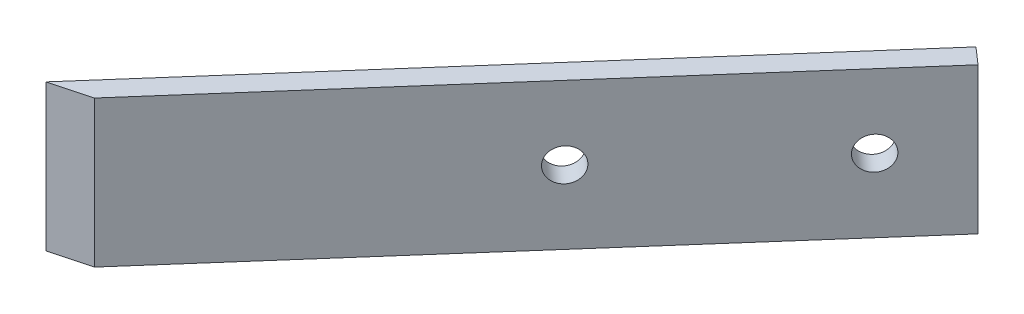
ISO-10303-21;
HEADER;
FILE_DESCRIPTION(('STEP AP214'),'2;1');
FILE_NAME('part.step','',(''),(''),'','','');
FILE_SCHEMA(('AUTOMOTIVE_DESIGN { 1 0 10303 214 1 1 1 1 }'));
ENDSEC;
DATA;
#1=APPLICATION_CONTEXT('core data for automotive mechanical design processes');
#2=APPLICATION_PROTOCOL_DEFINITION('international standard','automotive_design',2000,#1);
#3=PRODUCT_CONTEXT('',#1,'mechanical');
#4=PRODUCT('Part','Part','',(#3));
#5=PRODUCT_RELATED_PRODUCT_CATEGORY('part','',(#4));
#6=PRODUCT_DEFINITION_FORMATION('','',#4);
#7=PRODUCT_DEFINITION_CONTEXT('part definition',#1,'design');
#8=PRODUCT_DEFINITION('design','',#6,#7);
#9=PRODUCT_DEFINITION_SHAPE('','',#8);
#10=(LENGTH_UNIT() NAMED_UNIT(*) SI_UNIT(.MILLI.,.METRE.));
#11=(NAMED_UNIT(*) PLANE_ANGLE_UNIT() SI_UNIT($,.RADIAN.));
#12=(NAMED_UNIT(*) SI_UNIT($,.STERADIAN.) SOLID_ANGLE_UNIT());
#13=UNCERTAINTY_MEASURE_WITH_UNIT(LENGTH_MEASURE(1.E-05),#10,'distance_accuracy_value','');
#14=(GEOMETRIC_REPRESENTATION_CONTEXT(3) GLOBAL_UNCERTAINTY_ASSIGNED_CONTEXT((#13)) GLOBAL_UNIT_ASSIGNED_CONTEXT((#10,
#11,#12)) REPRESENTATION_CONTEXT('',''));
#15=CARTESIAN_POINT('',(0.,0.,0.));
#16=DIRECTION('',(0.,0.,1.));
#17=DIRECTION('',(1.,0.,0.));
#18=AXIS2_PLACEMENT_3D('',#15,#16,#17);
#19=CARTESIAN_POINT('',(-687.0497110642,0.,2119.761213542));
#20=DIRECTION('',(-0.751580596623482,0.,-0.659641271282423));
#21=DIRECTION('',(-0.659641271282423,0.,0.751580596623482));
#22=AXIS2_PLACEMENT_3D('',#19,#20,#21);
#23=CYLINDRICAL_SURFACE('',#22,4.5);
#24=CARTESIAN_POINT('',(-684.0358728717,0.,2122.406375039));
#25=DIRECTION('',(-0.751580596623482,0.,-0.659641271282423));
#26=DIRECTION('',(-0.659641271282423,0.,0.751580596623482));
#27=AXIS2_PLACEMENT_3D('',#24,#25,#26);
#28=CIRCLE('',#27,4.5);
#29=CARTESIAN_POINT('',(-687.0042585925,0.,2125.788487724));
#30=VERTEX_POINT('',#29);
#31=EDGE_CURVE('E153',#30,#30,#28,.T.);
#32=ORIENTED_EDGE('',*,*,#31,.T.);
#33=DIRECTION('',(0.751580596623482,0.,0.659641271282423));
#34=VECTOR('',#33,1.);
#35=CARTESIAN_POINT('',(-690.0180967849,0.,2123.143326226));
#36=LINE('',#35,#34);
#37=CARTESIAN_POINT('',(-682.4947750127,0.,2129.746335352));
#38=VERTEX_POINT('',#37);
#39=EDGE_CURVE('E11',#30,#38,#36,.T.);
#40=ORIENTED_EDGE('',*,*,#39,.T.);
#41=CARTESIAN_POINT('',(-679.526389292,0.,2126.364222667));
#42=DIRECTION('',(-0.751580596623482,0.,-0.659641271282423));
#43=DIRECTION('',(-0.659641271282423,0.,0.751580596623482));
#44=AXIS2_PLACEMENT_3D('',#41,#42,#43);
#45=CIRCLE('',#44,4.5);
#46=EDGE_CURVE('E134',#38,#38,#45,.T.);
#47=ORIENTED_EDGE('',*,*,#46,.F.);
#48=ORIENTED_EDGE('',*,*,#39,.F.);
#49=EDGE_LOOP('',(#32,#40,#47,#48));
#50=FACE_BOUND('',#49,.T.);
#51=ADVANCED_FACE('F17',(#50),#23,.F.);
#52=CARTESIAN_POINT('',(-647.4712347872,0.,2074.666377744));
#53=DIRECTION('',(-0.751580596623482,0.,-0.659641271282423));
#54=DIRECTION('',(-0.659641271282423,0.,0.751580596623482));
#55=AXIS2_PLACEMENT_3D('',#52,#53,#54);
#56=CYLINDRICAL_SURFACE('',#55,4.5);
#57=CARTESIAN_POINT('',(-644.4573965948,0.,2077.311539242));
#58=DIRECTION('',(-0.751580596623482,0.,-0.659641271282423));
#59=DIRECTION('',(-0.659641271282423,0.,0.751580596623482));
#60=AXIS2_PLACEMENT_3D('',#57,#58,#59);
#61=CIRCLE('',#60,4.5);
#62=CARTESIAN_POINT('',(-647.4257823155,0.,2080.693651927));
#63=VERTEX_POINT('',#62);
#64=EDGE_CURVE('E150',#63,#63,#61,.T.);
#65=ORIENTED_EDGE('',*,*,#64,.T.);
#66=DIRECTION('',(0.751580596623482,0.,0.659641271282423));
#67=VECTOR('',#66,1.);
#68=CARTESIAN_POINT('',(-650.439620508,0.,2078.048490429));
#69=LINE('',#68,#67);
#70=CARTESIAN_POINT('',(-642.9162987358,0.,2084.651499555));
#71=VERTEX_POINT('',#70);
#72=EDGE_CURVE('E21',#63,#71,#69,.T.);
#73=ORIENTED_EDGE('',*,*,#72,.T.);
#74=CARTESIAN_POINT('',(-639.947913015,0.,2081.26938687));
#75=DIRECTION('',(-0.751580596623482,0.,-0.659641271282423));
#76=DIRECTION('',(-0.659641271282423,0.,0.751580596623482));
#77=AXIS2_PLACEMENT_3D('',#74,#75,#76);
#78=CIRCLE('',#77,4.5);
#79=EDGE_CURVE('E137',#71,#71,#78,.T.);
#80=ORIENTED_EDGE('',*,*,#79,.F.);
#81=ORIENTED_EDGE('',*,*,#72,.F.);
#82=EDGE_LOOP('',(#65,#73,#80,#81));
#83=FACE_BOUND('',#82,.T.);
#84=ADVANCED_FACE('F160',(#83),#56,.F.);
#85=CARTESIAN_POINT('',(-7.764571353077,0.,1998.683051002));
#86=DIRECTION('',(-0.258819045102985,0.,-0.965925826288944));
#87=DIRECTION('',(-0.965925826288944,0.,0.258819045102985));
#88=AXIS2_PLACEMENT_3D('',#85,#86,#87);
#89=PLANE('',#88);
#90=DIRECTION('',(0.,1.,0.));
#91=VECTOR('',#90,1.);
#92=CARTESIAN_POINT('',(-739.5621359648,10.,2194.767617463));
#93=LINE('',#92,#91);
#94=CARTESIAN_POINT('',(-739.5621359648,-20.,2194.767617463));
#95=VERTEX_POINT('',#94);
#96=CARTESIAN_POINT('',(-739.5621359648,20.,2194.767617463));
#97=VERTEX_POINT('',#96);
#98=EDGE_CURVE('E129',#95,#97,#93,.T.);
#99=ORIENTED_EDGE('',*,*,#98,.T.);
#100=DIRECTION('',(0.965925826288944,0.,-0.258819045102985));
#101=VECTOR('',#100,1.);
#102=CARTESIAN_POINT('',(-306.5808906206,20.,2078.750642435));
#103=LINE('',#102,#101);
#104=CARTESIAN_POINT('',(-750.,20.,2197.564434702));
#105=VERTEX_POINT('',#104);
#106=EDGE_CURVE('E94',#105,#97,#103,.T.);
#107=ORIENTED_EDGE('',*,*,#106,.F.);
#108=DIRECTION('',(0.,-1.,0.));
#109=VECTOR('',#108,1.);
#110=CARTESIAN_POINT('',(-750.,20.,2197.564434702));
#111=LINE('',#110,#109);
#112=CARTESIAN_POINT('',(-750.,-20.,2197.564434702));
#113=VERTEX_POINT('',#112);
#114=EDGE_CURVE('E144',#105,#113,#111,.T.);
#115=ORIENTED_EDGE('',*,*,#114,.T.);
#116=DIRECTION('',(0.965925826288944,0.,-0.258819045102985));
#117=VECTOR('',#116,1.);
#118=CARTESIAN_POINT('',(-306.5808906206,-20.,2078.750642435));
#119=LINE('',#118,#117);
#120=EDGE_CURVE('E130',#113,#95,#119,.T.);
#121=ORIENTED_EDGE('',*,*,#120,.T.);
#122=EDGE_LOOP('',(#99,#107,#115,#121));
#123=FACE_BOUND('',#122,.T.);
#124=ADVANCED_FACE('F19',(#123),#89,.F.);
#125=CARTESIAN_POINT('',(-631.2645711691,20.,2062.27992731));
#126=DIRECTION('',(0.751580596623482,0.,0.659641271282423));
#127=DIRECTION('',(0.,-1.,0.));
#128=AXIS2_PLACEMENT_3D('',#125,#126,#127);
#129=PLANE('',#128);
#130=ORIENTED_EDGE('',*,*,#31,.F.);
#131=EDGE_LOOP('',(#130));
#132=FACE_BOUND('',#131,.T.);
#133=ORIENTED_EDGE('',*,*,#64,.F.);
#134=EDGE_LOOP('',(#133));
#135=FACE_BOUND('',#134,.T.);
#136=DIRECTION('',(-0.659641271282423,0.,0.751580596623482));
#137=VECTOR('',#136,1.);
#138=CARTESIAN_POINT('',(-631.2645711691,-20.,2062.27992731));
#139=LINE('',#138,#137);
#140=CARTESIAN_POINT('',(-631.2645711691,-20.,2062.27992731));
#141=VERTEX_POINT('',#140);
#142=EDGE_CURVE('E133',#141,#113,#139,.T.);
#143=ORIENTED_EDGE('',*,*,#142,.T.);
#144=ORIENTED_EDGE('',*,*,#114,.F.);
#145=DIRECTION('',(-0.659641271282423,0.,0.751580596623482));
#146=VECTOR('',#145,1.);
#147=CARTESIAN_POINT('',(-631.2645711691,20.,2062.27992731));
#148=LINE('',#147,#146);
#149=CARTESIAN_POINT('',(-631.2645711691,20.,2062.27992731));
#150=VERTEX_POINT('',#149);
#151=EDGE_CURVE('E99',#150,#105,#148,.T.);
#152=ORIENTED_EDGE('',*,*,#151,.F.);
#153=DIRECTION('',(0.,-1.,0.));
#154=VECTOR('',#153,1.);
#155=CARTESIAN_POINT('',(-631.2645711691,20.,2062.27992731));
#156=LINE('',#155,#154);
#157=EDGE_CURVE('E107',#150,#141,#156,.T.);
#158=ORIENTED_EDGE('',*,*,#157,.T.);
#159=EDGE_LOOP('',(#143,#144,#152,#158));
#160=FACE_BOUND('',#159,.T.);
#161=ADVANCED_FACE('F174',(#132,#135,#160),#129,.F.);
#162=CARTESIAN_POINT('',(-631.2645711691,-20.,2062.27992731));
#163=DIRECTION('',(0.,-1.,0.));
#164=DIRECTION('',(0.,0.,-1.));
#165=AXIS2_PLACEMENT_3D('',#162,#163,#164);
#166=PLANE('',#165);
#167=ORIENTED_EDGE('',*,*,#120,.F.);
#168=ORIENTED_EDGE('',*,*,#142,.F.);
#169=DIRECTION('',(0.751580596623482,0.,0.659641271282423));
#170=VECTOR('',#169,1.);
#171=CARTESIAN_POINT('',(-631.2645711691,-20.,2062.27992731));
#172=LINE('',#171,#170);
#173=CARTESIAN_POINT('',(-626.7550875894,-20.,2066.237774937));
#174=VERTEX_POINT('',#173);
#175=EDGE_CURVE('E115',#141,#174,#172,.T.);
#176=ORIENTED_EDGE('',*,*,#175,.T.);
#177=DIRECTION('',(-0.659641271282423,0.,0.751580596623482));
#178=VECTOR('',#177,1.);
#179=CARTESIAN_POINT('',(-626.7550875894,-20.,2066.237774937));
#180=LINE('',#179,#178);
#181=EDGE_CURVE('E112',#174,#95,#180,.T.);
#182=ORIENTED_EDGE('',*,*,#181,.T.);
#183=EDGE_LOOP('',(#167,#168,#176,#182));
#184=FACE_BOUND('',#183,.T.);
#185=ADVANCED_FACE('F164',(#184),#166,.T.);
#186=CARTESIAN_POINT('',(-626.7550875894,20.,2066.237774937));
#187=DIRECTION('',(0.751580596623482,0.,0.659641271282423));
#188=DIRECTION('',(0.,-1.,0.));
#189=AXIS2_PLACEMENT_3D('',#186,#187,#188);
#190=PLANE('',#189);
#191=ORIENTED_EDGE('',*,*,#46,.T.);
#192=EDGE_LOOP('',(#191));
#193=FACE_BOUND('',#192,.T.);
#194=ORIENTED_EDGE('',*,*,#79,.T.);
#195=EDGE_LOOP('',(#194));
#196=FACE_BOUND('',#195,.T.);
#197=ORIENTED_EDGE('',*,*,#181,.F.);
#198=DIRECTION('',(0.,-1.,0.));
#199=VECTOR('',#198,1.);
#200=CARTESIAN_POINT('',(-626.7550875894,20.,2066.237774937));
#201=LINE('',#200,#199);
#202=CARTESIAN_POINT('',(-626.7550875894,20.,2066.237774937));
#203=VERTEX_POINT('',#202);
#204=EDGE_CURVE('E105',#203,#174,#201,.T.);
#205=ORIENTED_EDGE('',*,*,#204,.F.);
#206=DIRECTION('',(-0.659641271282423,0.,0.751580596623482));
#207=VECTOR('',#206,1.);
#208=CARTESIAN_POINT('',(-626.7550875894,20.,2066.237774937));
#209=LINE('',#208,#207);
#210=EDGE_CURVE('E87',#203,#97,#209,.T.);
#211=ORIENTED_EDGE('',*,*,#210,.T.);
#212=ORIENTED_EDGE('',*,*,#98,.F.);
#213=EDGE_LOOP('',(#197,#205,#211,#212));
#214=FACE_BOUND('',#213,.T.);
#215=ADVANCED_FACE('F110',(#193,#196,#214),#190,.T.);
#216=CARTESIAN_POINT('',(-631.2645711691,20.,2062.27992731));
#217=DIRECTION('',(0.,-1.,0.));
#218=DIRECTION('',(0.,0.,-1.));
#219=AXIS2_PLACEMENT_3D('',#216,#217,#218);
#220=PLANE('',#219);
#221=ORIENTED_EDGE('',*,*,#210,.F.);
#222=DIRECTION('',(0.751580596623482,0.,0.659641271282423));
#223=VECTOR('',#222,1.);
#224=CARTESIAN_POINT('',(-631.2645711691,20.,2062.27992731));
#225=LINE('',#224,#223);
#226=EDGE_CURVE('E91',#150,#203,#225,.T.);
#227=ORIENTED_EDGE('',*,*,#226,.F.);
#228=ORIENTED_EDGE('',*,*,#151,.T.);
#229=ORIENTED_EDGE('',*,*,#106,.T.);
#230=EDGE_LOOP('',(#221,#227,#228,#229));
#231=FACE_BOUND('',#230,.T.);
#232=ADVANCED_FACE('F89',(#231),#220,.F.);
#233=CARTESIAN_POINT('',(-631.2645711691,20.,2062.27992731));
#234=DIRECTION('',(-0.659641271282423,0.,0.751580596623482));
#235=DIRECTION('',(0.,1.,0.));
#236=AXIS2_PLACEMENT_3D('',#233,#234,#235);
#237=PLANE('',#236);
#238=ORIENTED_EDGE('',*,*,#204,.T.);
#239=ORIENTED_EDGE('',*,*,#175,.F.);
#240=ORIENTED_EDGE('',*,*,#157,.F.);
#241=ORIENTED_EDGE('',*,*,#226,.T.);
#242=EDGE_LOOP('',(#238,#239,#240,#241));
#243=FACE_BOUND('',#242,.T.);
#244=ADVANCED_FACE('F103',(#243),#237,.F.);
#245=CLOSED_SHELL('',(#51,#84,#124,#161,#185,#215,#232,#244));
#246=MANIFOLD_SOLID_BREP('B1',#245);
#247=ADVANCED_BREP_SHAPE_REPRESENTATION('',(#18,#246),#14);
#248=SHAPE_DEFINITION_REPRESENTATION(#9,#247);
ENDSEC;
END-ISO-10303-21;
